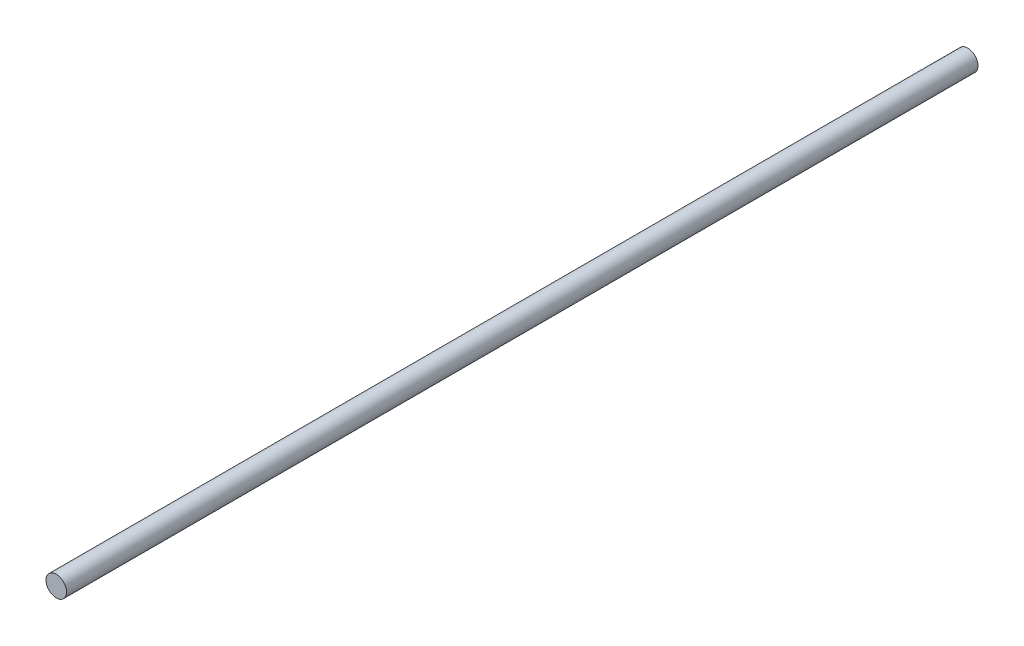
ISO-10303-21;
HEADER;
FILE_DESCRIPTION(('STEP AP214'),'2;1');
FILE_NAME('part.step','',(''),(''),'','','');
FILE_SCHEMA(('AUTOMOTIVE_DESIGN { 1 0 10303 214 1 1 1 1 }'));
ENDSEC;
DATA;
#1=APPLICATION_CONTEXT('core data for automotive mechanical design processes');
#2=APPLICATION_PROTOCOL_DEFINITION('international standard','automotive_design',2000,#1);
#3=PRODUCT_CONTEXT('',#1,'mechanical');
#4=PRODUCT('Part','Part','',(#3));
#5=PRODUCT_RELATED_PRODUCT_CATEGORY('part','',(#4));
#6=PRODUCT_DEFINITION_FORMATION('','',#4);
#7=PRODUCT_DEFINITION_CONTEXT('part definition',#1,'design');
#8=PRODUCT_DEFINITION('design','',#6,#7);
#9=PRODUCT_DEFINITION_SHAPE('','',#8);
#10=(LENGTH_UNIT() NAMED_UNIT(*) SI_UNIT(.MILLI.,.METRE.));
#11=(NAMED_UNIT(*) PLANE_ANGLE_UNIT() SI_UNIT($,.RADIAN.));
#12=(NAMED_UNIT(*) SI_UNIT($,.STERADIAN.) SOLID_ANGLE_UNIT());
#13=UNCERTAINTY_MEASURE_WITH_UNIT(LENGTH_MEASURE(1.E-05),#10,'distance_accuracy_value','');
#14=(GEOMETRIC_REPRESENTATION_CONTEXT(3) GLOBAL_UNCERTAINTY_ASSIGNED_CONTEXT((#13)) GLOBAL_UNIT_ASSIGNED_CONTEXT((#10,
#11,#12)) REPRESENTATION_CONTEXT('',''));
#15=CARTESIAN_POINT('',(0.,0.,0.));
#16=DIRECTION('',(0.,0.,1.));
#17=DIRECTION('',(1.,0.,0.));
#18=AXIS2_PLACEMENT_3D('',#15,#16,#17);
#19=CARTESIAN_POINT('',(0.,0.,133.));
#20=DIRECTION('',(0.,0.,-1.));
#21=DIRECTION('',(-1.,0.,0.));
#22=AXIS2_PLACEMENT_3D('',#19,#20,#21);
#23=CYLINDRICAL_SURFACE('',#22,1.5);
#24=CARTESIAN_POINT('',(0.,0.,133.));
#25=DIRECTION('',(0.,0.,1.));
#26=DIRECTION('',(1.,0.,0.));
#27=AXIS2_PLACEMENT_3D('',#24,#25,#26);
#28=CIRCLE('',#27,1.5);
#29=CARTESIAN_POINT('',(1.5,0.,133.));
#30=VERTEX_POINT('',#29);
#31=EDGE_CURVE('E10',#30,#30,#28,.T.);
#32=ORIENTED_EDGE('',*,*,#31,.F.);
#33=EDGE_LOOP('',(#32));
#34=FACE_BOUND('',#33,.T.);
#35=CARTESIAN_POINT('',(0.,0.,0.));
#36=DIRECTION('',(0.,0.,1.));
#37=DIRECTION('',(1.,0.,0.));
#38=AXIS2_PLACEMENT_3D('',#35,#36,#37);
#39=CIRCLE('',#38,1.5);
#40=CARTESIAN_POINT('',(1.5,0.,0.));
#41=VERTEX_POINT('',#40);
#42=EDGE_CURVE('E35',#41,#41,#39,.T.);
#43=ORIENTED_EDGE('',*,*,#42,.T.);
#44=EDGE_LOOP('',(#43));
#45=FACE_BOUND('',#44,.T.);
#46=ADVANCED_FACE('F32',(#34,#45),#23,.T.);
#47=CARTESIAN_POINT('',(0.,0.,133.));
#48=DIRECTION('',(0.,0.,1.));
#49=DIRECTION('',(1.,0.,0.));
#50=AXIS2_PLACEMENT_3D('',#47,#48,#49);
#51=PLANE('',#50);
#52=ORIENTED_EDGE('',*,*,#31,.T.);
#53=EDGE_LOOP('',(#52));
#54=FACE_BOUND('',#53,.T.);
#55=ADVANCED_FACE('F47',(#54),#51,.T.);
#56=CARTESIAN_POINT('',(0.,0.,0.));
#57=DIRECTION('',(0.,0.,1.));
#58=DIRECTION('',(1.,0.,0.));
#59=AXIS2_PLACEMENT_3D('',#56,#57,#58);
#60=PLANE('',#59);
#61=ORIENTED_EDGE('',*,*,#42,.F.);
#62=EDGE_LOOP('',(#61));
#63=FACE_BOUND('',#62,.T.);
#64=ADVANCED_FACE('F45',(#63),#60,.F.);
#65=CLOSED_SHELL('',(#46,#55,#64));
#66=MANIFOLD_SOLID_BREP('B2',#65);
#67=ADVANCED_BREP_SHAPE_REPRESENTATION('',(#18,#66),#14);
#68=SHAPE_DEFINITION_REPRESENTATION(#9,#67);
ENDSEC;
END-ISO-10303-21;
